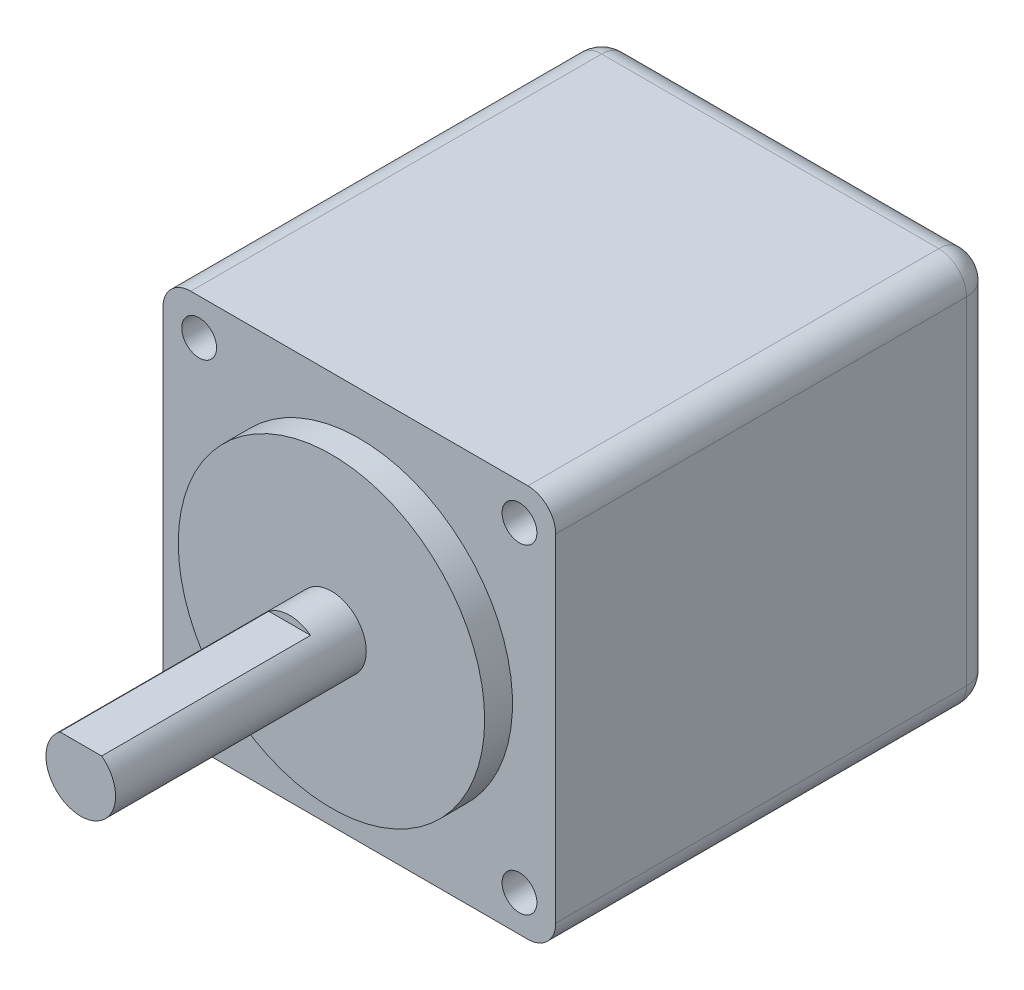
ISO-10303-21;
HEADER;
FILE_DESCRIPTION(('STEP AP214'),'2;1');
FILE_NAME('part.step','',(''),(''),'','','');
FILE_SCHEMA(('AUTOMOTIVE_DESIGN { 1 0 10303 214 1 1 1 1 }'));
ENDSEC;
DATA;
#1=APPLICATION_CONTEXT('core data for automotive mechanical design processes');
#2=APPLICATION_PROTOCOL_DEFINITION('international standard','automotive_design',2000,#1);
#3=PRODUCT_CONTEXT('',#1,'mechanical');
#4=PRODUCT('Part','Part','',(#3));
#5=PRODUCT_RELATED_PRODUCT_CATEGORY('part','',(#4));
#6=PRODUCT_DEFINITION_FORMATION('','',#4);
#7=PRODUCT_DEFINITION_CONTEXT('part definition',#1,'design');
#8=PRODUCT_DEFINITION('design','',#6,#7);
#9=PRODUCT_DEFINITION_SHAPE('','',#8);
#10=(LENGTH_UNIT() NAMED_UNIT(*) SI_UNIT(.MILLI.,.METRE.));
#11=(NAMED_UNIT(*) PLANE_ANGLE_UNIT() SI_UNIT($,.RADIAN.));
#12=(NAMED_UNIT(*) SI_UNIT($,.STERADIAN.) SOLID_ANGLE_UNIT());
#13=UNCERTAINTY_MEASURE_WITH_UNIT(LENGTH_MEASURE(1.E-05),#10,'distance_accuracy_value','');
#14=(GEOMETRIC_REPRESENTATION_CONTEXT(3) GLOBAL_UNCERTAINTY_ASSIGNED_CONTEXT((#13)) GLOBAL_UNIT_ASSIGNED_CONTEXT((#10,
#11,#12)) REPRESENTATION_CONTEXT('',''));
#15=CARTESIAN_POINT('',(0.,0.,0.));
#16=DIRECTION('',(0.,0.,1.));
#17=DIRECTION('',(1.,0.,0.));
#18=AXIS2_PLACEMENT_3D('',#15,#16,#17);
#19=CARTESIAN_POINT('',(0.,0.,33.5));
#20=DIRECTION('',(0.,0.,1.));
#21=DIRECTION('',(1.,0.,0.));
#22=AXIS2_PLACEMENT_3D('',#19,#20,#21);
#23=PLANE('',#22);
#24=CARTESIAN_POINT('',(0.,0.,33.5));
#25=DIRECTION('',(0.,0.,1.));
#26=DIRECTION('',(1.,0.,0.));
#27=AXIS2_PLACEMENT_3D('',#24,#25,#26);
#28=CIRCLE('',#27,11.);
#29=CARTESIAN_POINT('',(11.,0.,33.5));
#30=VERTEX_POINT('',#29);
#31=EDGE_CURVE('E144',#30,#30,#28,.T.);
#32=ORIENTED_EDGE('',*,*,#31,.T.);
#33=EDGE_LOOP('',(#32));
#34=FACE_BOUND('',#33,.T.);
#35=CARTESIAN_POINT('',(0.,0.,33.5));
#36=DIRECTION('',(0.,0.,1.));
#37=DIRECTION('',(1.,0.,0.));
#38=AXIS2_PLACEMENT_3D('',#35,#36,#37);
#39=CIRCLE('',#38,2.5);
#40=CARTESIAN_POINT('',(2.5,0.,33.5));
#41=VERTEX_POINT('',#40);
#42=EDGE_CURVE('E145',#41,#41,#39,.T.);
#43=ORIENTED_EDGE('',*,*,#42,.F.);
#44=EDGE_LOOP('',(#43));
#45=FACE_BOUND('',#44,.T.);
#46=ADVANCED_FACE('F33',(#34,#45),#23,.T.);
#47=CARTESIAN_POINT('',(14.1,14.1,31.5));
#48=DIRECTION('',(0.,0.,-1.));
#49=DIRECTION('',(-1.,0.,0.));
#50=AXIS2_PLACEMENT_3D('',#47,#48,#49);
#51=PLANE('',#50);
#52=CARTESIAN_POINT('',(-11.4999999999997,-11.5,31.5));
#53=DIRECTION('',(0.,0.,1.));
#54=DIRECTION('',(1.,0.,0.));
#55=AXIS2_PLACEMENT_3D('',#52,#53,#54);
#56=CIRCLE('',#55,1.25000000000024);
#57=CARTESIAN_POINT('',(-10.2499999999994,-11.5,31.5));
#58=VERTEX_POINT('',#57);
#59=EDGE_CURVE('E237',#58,#58,#56,.T.);
#60=ORIENTED_EDGE('',*,*,#59,.F.);
#61=EDGE_LOOP('',(#60));
#62=FACE_BOUND('',#61,.T.);
#63=CARTESIAN_POINT('',(11.5000000000003,-11.4999999999997,31.5));
#64=DIRECTION('',(0.,0.,1.));
#65=DIRECTION('',(1.,0.,0.));
#66=AXIS2_PLACEMENT_3D('',#63,#64,#65);
#67=CIRCLE('',#66,1.25000000000049);
#68=CARTESIAN_POINT('',(12.7500000000008,-11.4999999999997,31.5));
#69=VERTEX_POINT('',#68);
#70=EDGE_CURVE('E245',#69,#69,#67,.T.);
#71=ORIENTED_EDGE('',*,*,#70,.F.);
#72=EDGE_LOOP('',(#71));
#73=FACE_BOUND('',#72,.T.);
#74=CARTESIAN_POINT('',(11.5,11.5000000000003,31.5));
#75=DIRECTION('',(0.,0.,1.));
#76=DIRECTION('',(1.,0.,0.));
#77=AXIS2_PLACEMENT_3D('',#74,#75,#76);
#78=CIRCLE('',#77,1.25000000000035);
#79=CARTESIAN_POINT('',(12.7500000000003,11.5000000000003,31.5));
#80=VERTEX_POINT('',#79);
#81=EDGE_CURVE('E251',#80,#80,#78,.T.);
#82=ORIENTED_EDGE('',*,*,#81,.F.);
#83=EDGE_LOOP('',(#82));
#84=FACE_BOUND('',#83,.T.);
#85=CARTESIAN_POINT('',(-11.5,11.5,31.5));
#86=DIRECTION('',(0.,0.,1.));
#87=DIRECTION('',(1.,0.,0.));
#88=AXIS2_PLACEMENT_3D('',#85,#86,#87);
#89=CIRCLE('',#88,1.25);
#90=CARTESIAN_POINT('',(-10.25,11.5,31.5));
#91=VERTEX_POINT('',#90);
#92=EDGE_CURVE('E257',#91,#91,#89,.T.);
#93=ORIENTED_EDGE('',*,*,#92,.F.);
#94=EDGE_LOOP('',(#93));
#95=FACE_BOUND('',#94,.T.);
#96=DIRECTION('',(0.,-1.,0.));
#97=VECTOR('',#96,1.);
#98=CARTESIAN_POINT('',(-14.1,-14.1,31.5));
#99=LINE('',#98,#97);
#100=CARTESIAN_POINT('',(-14.1,12.1,31.5));
#101=VERTEX_POINT('',#100);
#102=CARTESIAN_POINT('',(-14.1,-12.1,31.5));
#103=VERTEX_POINT('',#102);
#104=EDGE_CURVE('E159',#101,#103,#99,.T.);
#105=ORIENTED_EDGE('',*,*,#104,.T.);
#106=CARTESIAN_POINT('',(-12.1,-12.1,31.5));
#107=DIRECTION('',(0.,0.,-1.));
#108=DIRECTION('',(-1.,0.,0.));
#109=AXIS2_PLACEMENT_3D('',#106,#107,#108);
#110=CIRCLE('',#109,2.);
#111=CARTESIAN_POINT('',(-12.1,-14.1,31.5));
#112=VERTEX_POINT('',#111);
#113=EDGE_CURVE('E11',#103,#112,#110,.F.);
#114=ORIENTED_EDGE('',*,*,#113,.T.);
#115=DIRECTION('',(1.,0.,0.));
#116=VECTOR('',#115,1.);
#117=CARTESIAN_POINT('',(-14.1,-14.1,31.5));
#118=LINE('',#117,#116);
#119=CARTESIAN_POINT('',(12.1,-14.1,31.5));
#120=VERTEX_POINT('',#119);
#121=EDGE_CURVE('E162',#112,#120,#118,.T.);
#122=ORIENTED_EDGE('',*,*,#121,.T.);
#123=CARTESIAN_POINT('',(12.1,-12.1,31.5));
#124=DIRECTION('',(0.,0.,-1.));
#125=DIRECTION('',(-1.,0.,0.));
#126=AXIS2_PLACEMENT_3D('',#123,#124,#125);
#127=CIRCLE('',#126,2.);
#128=CARTESIAN_POINT('',(14.1,-12.1,31.5));
#129=VERTEX_POINT('',#128);
#130=EDGE_CURVE('E42',#120,#129,#127,.F.);
#131=ORIENTED_EDGE('',*,*,#130,.T.);
#132=DIRECTION('',(0.,1.,0.));
#133=VECTOR('',#132,1.);
#134=CARTESIAN_POINT('',(14.1,-14.1,31.5));
#135=LINE('',#134,#133);
#136=CARTESIAN_POINT('',(14.1,12.1,31.5));
#137=VERTEX_POINT('',#136);
#138=EDGE_CURVE('E148',#129,#137,#135,.T.);
#139=ORIENTED_EDGE('',*,*,#138,.T.);
#140=CARTESIAN_POINT('',(12.1,12.1,31.5));
#141=DIRECTION('',(0.,0.,-1.));
#142=DIRECTION('',(-1.,0.,0.));
#143=AXIS2_PLACEMENT_3D('',#140,#141,#142);
#144=CIRCLE('',#143,2.);
#145=CARTESIAN_POINT('',(12.1,14.1,31.5));
#146=VERTEX_POINT('',#145);
#147=EDGE_CURVE('E200',#137,#146,#144,.F.);
#148=ORIENTED_EDGE('',*,*,#147,.T.);
#149=DIRECTION('',(-1.,0.,0.));
#150=VECTOR('',#149,1.);
#151=CARTESIAN_POINT('',(-14.1,14.1,31.5));
#152=LINE('',#151,#150);
#153=CARTESIAN_POINT('',(-12.1,14.1,31.5));
#154=VERTEX_POINT('',#153);
#155=EDGE_CURVE('E156',#146,#154,#152,.T.);
#156=ORIENTED_EDGE('',*,*,#155,.T.);
#157=CARTESIAN_POINT('',(-12.1,12.1,31.5));
#158=DIRECTION('',(0.,0.,-1.));
#159=DIRECTION('',(-1.,0.,0.));
#160=AXIS2_PLACEMENT_3D('',#157,#158,#159);
#161=CIRCLE('',#160,2.);
#162=EDGE_CURVE('E202',#154,#101,#161,.F.);
#163=ORIENTED_EDGE('',*,*,#162,.T.);
#164=EDGE_LOOP('',(#105,#114,#122,#131,#139,#148,#156,#163));
#165=FACE_BOUND('',#164,.T.);
#166=CARTESIAN_POINT('',(0.,0.,31.5));
#167=DIRECTION('',(0.,0.,-1.));
#168=DIRECTION('',(-1.,0.,0.));
#169=AXIS2_PLACEMENT_3D('',#166,#167,#168);
#170=CIRCLE('',#169,11.);
#171=CARTESIAN_POINT('',(-11.,0.,31.5));
#172=VERTEX_POINT('',#171);
#173=EDGE_CURVE('E134',#172,#172,#170,.F.);
#174=ORIENTED_EDGE('',*,*,#173,.F.);
#175=EDGE_LOOP('',(#174));
#176=FACE_BOUND('',#175,.T.);
#177=ADVANCED_FACE('F278',(#62,#73,#84,#95,#165,#176),#51,.F.);
#178=CARTESIAN_POINT('',(14.1,-14.1,31.5));
#179=DIRECTION('',(-1.,0.,0.));
#180=DIRECTION('',(0.,0.,1.));
#181=AXIS2_PLACEMENT_3D('',#178,#179,#180);
#182=PLANE('',#181);
#183=ORIENTED_EDGE('',*,*,#138,.F.);
#184=DIRECTION('',(0.,0.,-1.));
#185=VECTOR('',#184,1.);
#186=CARTESIAN_POINT('',(14.1,-12.1,31.5));
#187=LINE('',#186,#185);
#188=CARTESIAN_POINT('',(14.1,-12.1,2.));
#189=VERTEX_POINT('',#188);
#190=EDGE_CURVE('E50',#129,#189,#187,.T.);
#191=ORIENTED_EDGE('',*,*,#190,.T.);
#192=DIRECTION('',(0.,1.,0.));
#193=VECTOR('',#192,1.);
#194=CARTESIAN_POINT('',(14.1,14.1,2.));
#195=LINE('',#194,#193);
#196=CARTESIAN_POINT('',(14.1,12.1,2.));
#197=VERTEX_POINT('',#196);
#198=EDGE_CURVE('E55',#189,#197,#195,.T.);
#199=ORIENTED_EDGE('',*,*,#198,.T.);
#200=DIRECTION('',(0.,0.,-1.));
#201=VECTOR('',#200,1.);
#202=CARTESIAN_POINT('',(14.1,12.1,31.5));
#203=LINE('',#202,#201);
#204=EDGE_CURVE('E196',#197,#137,#203,.F.);
#205=ORIENTED_EDGE('',*,*,#204,.T.);
#206=EDGE_LOOP('',(#183,#191,#199,#205));
#207=FACE_BOUND('',#206,.T.);
#208=ADVANCED_FACE('F284',(#207),#182,.F.);
#209=CARTESIAN_POINT('',(-14.1,14.1,31.5));
#210=DIRECTION('',(0.,-1.,0.));
#211=DIRECTION('',(0.,0.,-1.));
#212=AXIS2_PLACEMENT_3D('',#209,#210,#211);
#213=PLANE('',#212);
#214=DIRECTION('',(-1.,0.,0.));
#215=VECTOR('',#214,1.);
#216=CARTESIAN_POINT('',(-14.1,14.1,2.));
#217=LINE('',#216,#215);
#218=CARTESIAN_POINT('',(12.1,14.1,2.));
#219=VERTEX_POINT('',#218);
#220=CARTESIAN_POINT('',(-12.1,14.1,2.));
#221=VERTEX_POINT('',#220);
#222=EDGE_CURVE('E170',#219,#221,#217,.T.);
#223=ORIENTED_EDGE('',*,*,#222,.T.);
#224=DIRECTION('',(0.,0.,-1.));
#225=VECTOR('',#224,1.);
#226=CARTESIAN_POINT('',(-12.1,14.1,31.5));
#227=LINE('',#226,#225);
#228=EDGE_CURVE('E173',#221,#154,#227,.F.);
#229=ORIENTED_EDGE('',*,*,#228,.T.);
#230=ORIENTED_EDGE('',*,*,#155,.F.);
#231=DIRECTION('',(0.,0.,-1.));
#232=VECTOR('',#231,1.);
#233=CARTESIAN_POINT('',(12.1,14.1,31.5));
#234=LINE('',#233,#232);
#235=EDGE_CURVE('E168',#146,#219,#234,.T.);
#236=ORIENTED_EDGE('',*,*,#235,.T.);
#237=EDGE_LOOP('',(#223,#229,#230,#236));
#238=FACE_BOUND('',#237,.T.);
#239=ADVANCED_FACE('F305',(#238),#213,.F.);
#240=CARTESIAN_POINT('',(-14.1,-14.1,31.5));
#241=DIRECTION('',(1.,0.,0.));
#242=DIRECTION('',(0.,0.,-1.));
#243=AXIS2_PLACEMENT_3D('',#240,#241,#242);
#244=PLANE('',#243);
#245=DIRECTION('',(0.,-1.,0.));
#246=VECTOR('',#245,1.);
#247=CARTESIAN_POINT('',(-14.1,-14.1,2.));
#248=LINE('',#247,#246);
#249=CARTESIAN_POINT('',(-14.1,12.1,2.));
#250=VERTEX_POINT('',#249);
#251=CARTESIAN_POINT('',(-14.1,-12.1,2.));
#252=VERTEX_POINT('',#251);
#253=EDGE_CURVE('E186',#250,#252,#248,.T.);
#254=ORIENTED_EDGE('',*,*,#253,.T.);
#255=DIRECTION('',(0.,0.,-1.));
#256=VECTOR('',#255,1.);
#257=CARTESIAN_POINT('',(-14.1,-12.1,31.5));
#258=LINE('',#257,#256);
#259=EDGE_CURVE('E188',#252,#103,#258,.F.);
#260=ORIENTED_EDGE('',*,*,#259,.T.);
#261=ORIENTED_EDGE('',*,*,#104,.F.);
#262=DIRECTION('',(0.,0.,-1.));
#263=VECTOR('',#262,1.);
#264=CARTESIAN_POINT('',(-14.1,12.1,31.5));
#265=LINE('',#264,#263);
#266=EDGE_CURVE('E184',#101,#250,#265,.T.);
#267=ORIENTED_EDGE('',*,*,#266,.T.);
#268=EDGE_LOOP('',(#254,#260,#261,#267));
#269=FACE_BOUND('',#268,.T.);
#270=ADVANCED_FACE('F301',(#269),#244,.F.);
#271=CARTESIAN_POINT('',(-14.1,-14.1,31.5));
#272=DIRECTION('',(0.,1.,0.));
#273=DIRECTION('',(0.,0.,1.));
#274=AXIS2_PLACEMENT_3D('',#271,#272,#273);
#275=PLANE('',#274);
#276=ORIENTED_EDGE('',*,*,#121,.F.);
#277=DIRECTION('',(0.,0.,-1.));
#278=VECTOR('',#277,1.);
#279=CARTESIAN_POINT('',(-12.1,-14.1,31.5));
#280=LINE('',#279,#278);
#281=CARTESIAN_POINT('',(-12.1,-14.1,2.));
#282=VERTEX_POINT('',#281);
#283=EDGE_CURVE('E194',#112,#282,#280,.T.);
#284=ORIENTED_EDGE('',*,*,#283,.T.);
#285=DIRECTION('',(1.,0.,0.));
#286=VECTOR('',#285,1.);
#287=CARTESIAN_POINT('',(14.1,-14.1,2.));
#288=LINE('',#287,#286);
#289=CARTESIAN_POINT('',(12.1,-14.1,2.));
#290=VERTEX_POINT('',#289);
#291=EDGE_CURVE('E192',#282,#290,#288,.T.);
#292=ORIENTED_EDGE('',*,*,#291,.T.);
#293=DIRECTION('',(0.,0.,-1.));
#294=VECTOR('',#293,1.);
#295=CARTESIAN_POINT('',(12.1,-14.1,31.5));
#296=LINE('',#295,#294);
#297=EDGE_CURVE('E190',#290,#120,#296,.F.);
#298=ORIENTED_EDGE('',*,*,#297,.T.);
#299=EDGE_LOOP('',(#276,#284,#292,#298));
#300=FACE_BOUND('',#299,.T.);
#301=ADVANCED_FACE('F297',(#300),#275,.F.);
#302=CARTESIAN_POINT('',(14.1,14.1,0.));
#303=DIRECTION('',(0.,0.,-1.));
#304=DIRECTION('',(-1.,0.,0.));
#305=AXIS2_PLACEMENT_3D('',#302,#303,#304);
#306=PLANE('',#305);
#307=DIRECTION('',(0.,-1.,0.));
#308=VECTOR('',#307,1.);
#309=CARTESIAN_POINT('',(-12.1,14.1,0.));
#310=LINE('',#309,#308);
#311=CARTESIAN_POINT('',(-12.1,-12.1,0.));
#312=VERTEX_POINT('',#311);
#313=CARTESIAN_POINT('',(-12.1,12.1,0.));
#314=VERTEX_POINT('',#313);
#315=EDGE_CURVE('E179',#312,#314,#310,.F.);
#316=ORIENTED_EDGE('',*,*,#315,.T.);
#317=DIRECTION('',(-1.,0.,0.));
#318=VECTOR('',#317,1.);
#319=CARTESIAN_POINT('',(14.1,12.1,0.));
#320=LINE('',#319,#318);
#321=CARTESIAN_POINT('',(12.1,12.1,0.));
#322=VERTEX_POINT('',#321);
#323=EDGE_CURVE('E181',#314,#322,#320,.F.);
#324=ORIENTED_EDGE('',*,*,#323,.T.);
#325=DIRECTION('',(0.,1.,0.));
#326=VECTOR('',#325,1.);
#327=CARTESIAN_POINT('',(12.1,-14.1,0.));
#328=LINE('',#327,#326);
#329=CARTESIAN_POINT('',(12.1,-12.1,0.));
#330=VERTEX_POINT('',#329);
#331=EDGE_CURVE('E175',#322,#330,#328,.F.);
#332=ORIENTED_EDGE('',*,*,#331,.T.);
#333=DIRECTION('',(1.,0.,0.));
#334=VECTOR('',#333,1.);
#335=CARTESIAN_POINT('',(-14.1,-12.1,0.));
#336=LINE('',#335,#334);
#337=EDGE_CURVE('E177',#330,#312,#336,.F.);
#338=ORIENTED_EDGE('',*,*,#337,.T.);
#339=EDGE_LOOP('',(#316,#324,#332,#338));
#340=FACE_BOUND('',#339,.T.);
#341=ADVANCED_FACE('F292',(#340),#306,.T.);
#342=CARTESIAN_POINT('',(0.,0.,33.5));
#343=DIRECTION('',(0.,0.,-1.));
#344=DIRECTION('',(-1.,0.,0.));
#345=AXIS2_PLACEMENT_3D('',#342,#343,#344);
#346=CYLINDRICAL_SURFACE('',#345,11.);
#347=ORIENTED_EDGE('',*,*,#31,.F.);
#348=EDGE_LOOP('',(#347));
#349=FACE_BOUND('',#348,.T.);
#350=ORIENTED_EDGE('',*,*,#173,.T.);
#351=EDGE_LOOP('',(#350));
#352=FACE_BOUND('',#351,.T.);
#353=ADVANCED_FACE('F290',(#349,#352),#346,.T.);
#354=CARTESIAN_POINT('',(0.,0.,51.5));
#355=DIRECTION('',(0.,0.,-1.));
#356=DIRECTION('',(-1.,0.,0.));
#357=AXIS2_PLACEMENT_3D('',#354,#355,#356);
#358=CYLINDRICAL_SURFACE('',#357,2.5);
#359=CARTESIAN_POINT('',(0.,0.,51.5));
#360=DIRECTION('',(0.,0.,1.));
#361=DIRECTION('',(1.,0.,0.));
#362=AXIS2_PLACEMENT_3D('',#359,#360,#361);
#363=CIRCLE('',#362,2.5);
#364=CARTESIAN_POINT('',(-1.5,2.,51.5));
#365=VERTEX_POINT('',#364);
#366=CARTESIAN_POINT('',(1.5,2.,51.5));
#367=VERTEX_POINT('',#366);
#368=EDGE_CURVE('E140',#365,#367,#363,.T.);
#369=ORIENTED_EDGE('',*,*,#368,.F.);
#370=DIRECTION('',(0.,0.,-1.));
#371=VECTOR('',#370,1.);
#372=CARTESIAN_POINT('',(-1.5,2.,51.5));
#373=LINE('',#372,#371);
#374=CARTESIAN_POINT('',(-1.5,2.,36.5));
#375=VERTEX_POINT('',#374);
#376=EDGE_CURVE('E129',#365,#375,#373,.T.);
#377=ORIENTED_EDGE('',*,*,#376,.T.);
#378=CARTESIAN_POINT('',(0.,0.,36.5));
#379=DIRECTION('',(0.,0.,-1.));
#380=DIRECTION('',(-1.,0.,0.));
#381=AXIS2_PLACEMENT_3D('',#378,#379,#380);
#382=CIRCLE('',#381,2.5);
#383=CARTESIAN_POINT('',(1.5,2.,36.5));
#384=VERTEX_POINT('',#383);
#385=EDGE_CURVE('E133',#375,#384,#382,.T.);
#386=ORIENTED_EDGE('',*,*,#385,.T.);
#387=DIRECTION('',(0.,0.,-1.));
#388=VECTOR('',#387,1.);
#389=CARTESIAN_POINT('',(1.5,2.,51.5));
#390=LINE('',#389,#388);
#391=EDGE_CURVE('E126',#384,#367,#390,.F.);
#392=ORIENTED_EDGE('',*,*,#391,.T.);
#393=EDGE_LOOP('',(#369,#377,#386,#392));
#394=FACE_BOUND('',#393,.T.);
#395=ORIENTED_EDGE('',*,*,#42,.T.);
#396=EDGE_LOOP('',(#395));
#397=FACE_BOUND('',#396,.T.);
#398=ADVANCED_FACE('F138',(#394,#397),#358,.T.);
#399=CARTESIAN_POINT('',(0.,0.,51.5));
#400=DIRECTION('',(0.,0.,1.));
#401=DIRECTION('',(1.,0.,0.));
#402=AXIS2_PLACEMENT_3D('',#399,#400,#401);
#403=PLANE('',#402);
#404=DIRECTION('',(1.,0.,0.));
#405=VECTOR('',#404,1.);
#406=CARTESIAN_POINT('',(0.,2.,51.5));
#407=LINE('',#406,#405);
#408=EDGE_CURVE('E122',#365,#367,#407,.T.);
#409=ORIENTED_EDGE('',*,*,#408,.F.);
#410=ORIENTED_EDGE('',*,*,#368,.T.);
#411=EDGE_LOOP('',(#409,#410));
#412=FACE_BOUND('',#411,.T.);
#413=ADVANCED_FACE('F143',(#412),#403,.T.);
#414=CARTESIAN_POINT('',(-5.,2.5,36.5));
#415=DIRECTION('',(0.,0.,-1.));
#416=DIRECTION('',(-1.,0.,0.));
#417=AXIS2_PLACEMENT_3D('',#414,#415,#416);
#418=PLANE('',#417);
#419=DIRECTION('',(1.,0.,0.));
#420=VECTOR('',#419,1.);
#421=CARTESIAN_POINT('',(-5.,2.,36.5));
#422=LINE('',#421,#420);
#423=EDGE_CURVE('E141',#375,#384,#422,.T.);
#424=ORIENTED_EDGE('',*,*,#423,.T.);
#425=ORIENTED_EDGE('',*,*,#385,.F.);
#426=EDGE_LOOP('',(#424,#425));
#427=FACE_BOUND('',#426,.T.);
#428=ADVANCED_FACE('F266',(#427),#418,.F.);
#429=CARTESIAN_POINT('',(-5.,2.,51.5));
#430=DIRECTION('',(0.,-1.,0.));
#431=DIRECTION('',(0.,0.,-1.));
#432=AXIS2_PLACEMENT_3D('',#429,#430,#431);
#433=PLANE('',#432);
#434=ORIENTED_EDGE('',*,*,#408,.T.);
#435=ORIENTED_EDGE('',*,*,#391,.F.);
#436=ORIENTED_EDGE('',*,*,#423,.F.);
#437=ORIENTED_EDGE('',*,*,#376,.F.);
#438=EDGE_LOOP('',(#434,#435,#436,#437));
#439=FACE_BOUND('',#438,.T.);
#440=ADVANCED_FACE('F124',(#439),#433,.F.);
#441=CARTESIAN_POINT('',(-11.5,11.5,29.));
#442=DIRECTION('',(0.,0.,1.));
#443=DIRECTION('',(1.,0.,0.));
#444=AXIS2_PLACEMENT_3D('',#441,#442,#443);
#445=CYLINDRICAL_SURFACE('',#444,1.25);
#446=CARTESIAN_POINT('',(-11.5,11.5,29.));
#447=DIRECTION('',(0.,0.,1.));
#448=DIRECTION('',(1.,0.,0.));
#449=AXIS2_PLACEMENT_3D('',#446,#447,#448);
#450=CIRCLE('',#449,1.25);
#451=CARTESIAN_POINT('',(-10.25,11.5,29.));
#452=VERTEX_POINT('',#451);
#453=EDGE_CURVE('E260',#452,#452,#450,.T.);
#454=ORIENTED_EDGE('',*,*,#453,.F.);
#455=EDGE_LOOP('',(#454));
#456=FACE_BOUND('',#455,.T.);
#457=ORIENTED_EDGE('',*,*,#92,.T.);
#458=EDGE_LOOP('',(#457));
#459=FACE_BOUND('',#458,.T.);
#460=ADVANCED_FACE('F273',(#456,#459),#445,.F.);
#461=CARTESIAN_POINT('',(-11.5,11.5,29.));
#462=DIRECTION('',(0.,0.,1.));
#463=DIRECTION('',(1.,0.,0.));
#464=AXIS2_PLACEMENT_3D('',#461,#462,#463);
#465=PLANE('',#464);
#466=ORIENTED_EDGE('',*,*,#453,.T.);
#467=EDGE_LOOP('',(#466));
#468=FACE_BOUND('',#467,.T.);
#469=ADVANCED_FACE('F418',(#468),#465,.T.);
#470=CARTESIAN_POINT('',(11.5,11.5000000000003,29.));
#471=DIRECTION('',(0.,0.,1.));
#472=DIRECTION('',(1.,0.,0.));
#473=AXIS2_PLACEMENT_3D('',#470,#471,#472);
#474=CYLINDRICAL_SURFACE('',#473,1.25000000000035);
#475=CARTESIAN_POINT('',(11.5,11.5000000000003,29.));
#476=DIRECTION('',(0.,0.,1.));
#477=DIRECTION('',(1.,0.,0.));
#478=AXIS2_PLACEMENT_3D('',#475,#476,#477);
#479=CIRCLE('',#478,1.25000000000035);
#480=CARTESIAN_POINT('',(12.7500000000003,11.5000000000003,29.));
#481=VERTEX_POINT('',#480);
#482=EDGE_CURVE('E254',#481,#481,#479,.T.);
#483=ORIENTED_EDGE('',*,*,#482,.F.);
#484=EDGE_LOOP('',(#483));
#485=FACE_BOUND('',#484,.T.);
#486=ORIENTED_EDGE('',*,*,#81,.T.);
#487=EDGE_LOOP('',(#486));
#488=FACE_BOUND('',#487,.T.);
#489=ADVANCED_FACE('F414',(#485,#488),#474,.F.);
#490=CARTESIAN_POINT('',(11.5,11.5000000000003,29.));
#491=DIRECTION('',(0.,0.,1.));
#492=DIRECTION('',(1.,0.,0.));
#493=AXIS2_PLACEMENT_3D('',#490,#491,#492);
#494=PLANE('',#493);
#495=ORIENTED_EDGE('',*,*,#482,.T.);
#496=EDGE_LOOP('',(#495));
#497=FACE_BOUND('',#496,.T.);
#498=ADVANCED_FACE('F410',(#497),#494,.T.);
#499=CARTESIAN_POINT('',(11.5000000000003,-11.4999999999997,29.));
#500=DIRECTION('',(0.,0.,1.));
#501=DIRECTION('',(1.,0.,0.));
#502=AXIS2_PLACEMENT_3D('',#499,#500,#501);
#503=CYLINDRICAL_SURFACE('',#502,1.25000000000049);
#504=CARTESIAN_POINT('',(11.5000000000003,-11.4999999999997,29.));
#505=DIRECTION('',(0.,0.,1.));
#506=DIRECTION('',(1.,0.,0.));
#507=AXIS2_PLACEMENT_3D('',#504,#505,#506);
#508=CIRCLE('',#507,1.25000000000049);
#509=CARTESIAN_POINT('',(12.7500000000008,-11.4999999999997,29.));
#510=VERTEX_POINT('',#509);
#511=EDGE_CURVE('E248',#510,#510,#508,.T.);
#512=ORIENTED_EDGE('',*,*,#511,.F.);
#513=EDGE_LOOP('',(#512));
#514=FACE_BOUND('',#513,.T.);
#515=ORIENTED_EDGE('',*,*,#70,.T.);
#516=EDGE_LOOP('',(#515));
#517=FACE_BOUND('',#516,.T.);
#518=ADVANCED_FACE('F406',(#514,#517),#503,.F.);
#519=CARTESIAN_POINT('',(11.5000000000003,-11.4999999999997,29.));
#520=DIRECTION('',(0.,0.,1.));
#521=DIRECTION('',(1.,0.,0.));
#522=AXIS2_PLACEMENT_3D('',#519,#520,#521);
#523=PLANE('',#522);
#524=ORIENTED_EDGE('',*,*,#511,.T.);
#525=EDGE_LOOP('',(#524));
#526=FACE_BOUND('',#525,.T.);
#527=ADVANCED_FACE('F400',(#526),#523,.T.);
#528=CARTESIAN_POINT('',(-11.4999999999997,-11.5,29.));
#529=DIRECTION('',(0.,0.,1.));
#530=DIRECTION('',(1.,0.,0.));
#531=AXIS2_PLACEMENT_3D('',#528,#529,#530);
#532=CYLINDRICAL_SURFACE('',#531,1.25000000000024);
#533=CARTESIAN_POINT('',(-11.4999999999997,-11.5,29.));
#534=DIRECTION('',(0.,0.,1.));
#535=DIRECTION('',(1.,0.,0.));
#536=AXIS2_PLACEMENT_3D('',#533,#534,#535);
#537=CIRCLE('',#536,1.25000000000024);
#538=CARTESIAN_POINT('',(-10.2499999999994,-11.5,29.));
#539=VERTEX_POINT('',#538);
#540=EDGE_CURVE('E240',#539,#539,#537,.T.);
#541=ORIENTED_EDGE('',*,*,#540,.F.);
#542=EDGE_LOOP('',(#541));
#543=FACE_BOUND('',#542,.T.);
#544=ORIENTED_EDGE('',*,*,#59,.T.);
#545=EDGE_LOOP('',(#544));
#546=FACE_BOUND('',#545,.T.);
#547=ADVANCED_FACE('F394',(#543,#546),#532,.F.);
#548=CARTESIAN_POINT('',(-11.4999999999997,-11.5,29.));
#549=DIRECTION('',(0.,0.,1.));
#550=DIRECTION('',(1.,0.,0.));
#551=AXIS2_PLACEMENT_3D('',#548,#549,#550);
#552=PLANE('',#551);
#553=ORIENTED_EDGE('',*,*,#540,.T.);
#554=EDGE_LOOP('',(#553));
#555=FACE_BOUND('',#554,.T.);
#556=ADVANCED_FACE('F356',(#555),#552,.T.);
#557=CARTESIAN_POINT('',(12.1,-12.1,31.5));
#558=DIRECTION('',(0.,0.,-1.));
#559=DIRECTION('',(-1.,0.,0.));
#560=AXIS2_PLACEMENT_3D('',#557,#558,#559);
#561=CYLINDRICAL_SURFACE('',#560,2.);
#562=ORIENTED_EDGE('',*,*,#130,.F.);
#563=ORIENTED_EDGE('',*,*,#297,.F.);
#564=CARTESIAN_POINT('',(12.1,-12.1,2.));
#565=DIRECTION('',(0.,0.,-1.));
#566=DIRECTION('',(-1.,0.,0.));
#567=AXIS2_PLACEMENT_3D('',#564,#565,#566);
#568=CIRCLE('',#567,2.);
#569=EDGE_CURVE('E232',#189,#290,#568,.T.);
#570=ORIENTED_EDGE('',*,*,#569,.F.);
#571=ORIENTED_EDGE('',*,*,#190,.F.);
#572=EDGE_LOOP('',(#562,#563,#570,#571));
#573=FACE_BOUND('',#572,.T.);
#574=ADVANCED_FACE('F35',(#573),#561,.T.);
#575=CARTESIAN_POINT('',(-12.1,-12.1,31.5));
#576=DIRECTION('',(0.,0.,-1.));
#577=DIRECTION('',(-1.,0.,0.));
#578=AXIS2_PLACEMENT_3D('',#575,#576,#577);
#579=CYLINDRICAL_SURFACE('',#578,2.);
#580=ORIENTED_EDGE('',*,*,#113,.F.);
#581=ORIENTED_EDGE('',*,*,#259,.F.);
#582=CARTESIAN_POINT('',(-12.1,-12.1,2.));
#583=DIRECTION('',(0.,0.,-1.));
#584=DIRECTION('',(-1.,0.,0.));
#585=AXIS2_PLACEMENT_3D('',#582,#583,#584);
#586=CIRCLE('',#585,2.);
#587=EDGE_CURVE('E230',#282,#252,#586,.T.);
#588=ORIENTED_EDGE('',*,*,#587,.F.);
#589=ORIENTED_EDGE('',*,*,#283,.F.);
#590=EDGE_LOOP('',(#580,#581,#588,#589));
#591=FACE_BOUND('',#590,.T.);
#592=ADVANCED_FACE('F349',(#591),#579,.T.);
#593=CARTESIAN_POINT('',(-14.1,-12.1,2.));
#594=DIRECTION('',(-1.,0.,0.));
#595=DIRECTION('',(0.,0.,1.));
#596=AXIS2_PLACEMENT_3D('',#593,#594,#595);
#597=CYLINDRICAL_SURFACE('',#596,2.);
#598=CARTESIAN_POINT('',(12.1,-12.1,2.));
#599=DIRECTION('',(1.,0.,0.));
#600=DIRECTION('',(0.,0.,-1.));
#601=AXIS2_PLACEMENT_3D('',#598,#599,#600);
#602=CIRCLE('',#601,2.);
#603=EDGE_CURVE('E37',#290,#330,#602,.T.);
#604=ORIENTED_EDGE('',*,*,#603,.F.);
#605=ORIENTED_EDGE('',*,*,#291,.F.);
#606=CARTESIAN_POINT('',(-12.1,-12.1,2.));
#607=DIRECTION('',(-1.,0.,0.));
#608=DIRECTION('',(0.,0.,1.));
#609=AXIS2_PLACEMENT_3D('',#606,#607,#608);
#610=CIRCLE('',#609,2.);
#611=EDGE_CURVE('E227',#312,#282,#610,.T.);
#612=ORIENTED_EDGE('',*,*,#611,.F.);
#613=ORIENTED_EDGE('',*,*,#337,.F.);
#614=EDGE_LOOP('',(#604,#605,#612,#613));
#615=FACE_BOUND('',#614,.T.);
#616=ADVANCED_FACE('F347',(#615),#597,.T.);
#617=CARTESIAN_POINT('',(12.1,-12.1,2.));
#618=DIRECTION('',(0.,0.,1.));
#619=DIRECTION('',(1.,0.,0.));
#620=AXIS2_PLACEMENT_3D('',#617,#618,#619);
#621=SPHERICAL_SURFACE('',#620,2.);
#622=ORIENTED_EDGE('',*,*,#569,.T.);
#623=ORIENTED_EDGE('',*,*,#603,.T.);
#624=CARTESIAN_POINT('',(12.1,-12.1,2.));
#625=DIRECTION('',(0.,-1.,0.));
#626=DIRECTION('',(0.,0.,-1.));
#627=AXIS2_PLACEMENT_3D('',#624,#625,#626);
#628=CIRCLE('',#627,2.);
#629=EDGE_CURVE('E224',#189,#330,#628,.F.);
#630=ORIENTED_EDGE('',*,*,#629,.F.);
#631=EDGE_LOOP('',(#622,#623,#630));
#632=FACE_BOUND('',#631,.T.);
#633=ADVANCED_FACE('F343',(#632),#621,.T.);
#634=CARTESIAN_POINT('',(-12.1,-12.1,2.));
#635=DIRECTION('',(0.,0.,1.));
#636=DIRECTION('',(1.,0.,0.));
#637=AXIS2_PLACEMENT_3D('',#634,#635,#636);
#638=SPHERICAL_SURFACE('',#637,2.);
#639=ORIENTED_EDGE('',*,*,#611,.T.);
#640=ORIENTED_EDGE('',*,*,#587,.T.);
#641=CARTESIAN_POINT('',(-12.1,-12.1,2.));
#642=DIRECTION('',(0.,-1.,0.));
#643=DIRECTION('',(0.,0.,-1.));
#644=AXIS2_PLACEMENT_3D('',#641,#642,#643);
#645=CIRCLE('',#644,2.);
#646=EDGE_CURVE('E221',#312,#252,#645,.F.);
#647=ORIENTED_EDGE('',*,*,#646,.F.);
#648=EDGE_LOOP('',(#639,#640,#647));
#649=FACE_BOUND('',#648,.T.);
#650=ADVANCED_FACE('F339',(#649),#638,.T.);
#651=CARTESIAN_POINT('',(12.1,-14.1,2.));
#652=DIRECTION('',(0.,-1.,0.));
#653=DIRECTION('',(0.,0.,-1.));
#654=AXIS2_PLACEMENT_3D('',#651,#652,#653);
#655=CYLINDRICAL_SURFACE('',#654,2.);
#656=ORIENTED_EDGE('',*,*,#629,.T.);
#657=ORIENTED_EDGE('',*,*,#331,.F.);
#658=CARTESIAN_POINT('',(12.1,12.1,2.));
#659=DIRECTION('',(0.,1.,0.));
#660=DIRECTION('',(0.,0.,1.));
#661=AXIS2_PLACEMENT_3D('',#658,#659,#660);
#662=CIRCLE('',#661,2.);
#663=EDGE_CURVE('E218',#197,#322,#662,.T.);
#664=ORIENTED_EDGE('',*,*,#663,.F.);
#665=ORIENTED_EDGE('',*,*,#198,.F.);
#666=EDGE_LOOP('',(#656,#657,#664,#665));
#667=FACE_BOUND('',#666,.T.);
#668=ADVANCED_FACE('F335',(#667),#655,.T.);
#669=CARTESIAN_POINT('',(12.1,12.1,31.5));
#670=DIRECTION('',(0.,0.,-1.));
#671=DIRECTION('',(-1.,0.,0.));
#672=AXIS2_PLACEMENT_3D('',#669,#670,#671);
#673=CYLINDRICAL_SURFACE('',#672,2.);
#674=ORIENTED_EDGE('',*,*,#147,.F.);
#675=ORIENTED_EDGE('',*,*,#204,.F.);
#676=CARTESIAN_POINT('',(12.1,12.1,2.));
#677=DIRECTION('',(0.,0.,-1.));
#678=DIRECTION('',(-1.,0.,0.));
#679=AXIS2_PLACEMENT_3D('',#676,#677,#678);
#680=CIRCLE('',#679,2.);
#681=EDGE_CURVE('E215',#219,#197,#680,.T.);
#682=ORIENTED_EDGE('',*,*,#681,.F.);
#683=ORIENTED_EDGE('',*,*,#235,.F.);
#684=EDGE_LOOP('',(#674,#675,#682,#683));
#685=FACE_BOUND('',#684,.T.);
#686=ADVANCED_FACE('F331',(#685),#673,.T.);
#687=CARTESIAN_POINT('',(-12.1,12.1,31.5));
#688=DIRECTION('',(0.,0.,-1.));
#689=DIRECTION('',(-1.,0.,0.));
#690=AXIS2_PLACEMENT_3D('',#687,#688,#689);
#691=CYLINDRICAL_SURFACE('',#690,2.);
#692=ORIENTED_EDGE('',*,*,#162,.F.);
#693=ORIENTED_EDGE('',*,*,#228,.F.);
#694=CARTESIAN_POINT('',(-12.1,12.1,2.));
#695=DIRECTION('',(0.,0.,-1.));
#696=DIRECTION('',(-1.,0.,0.));
#697=AXIS2_PLACEMENT_3D('',#694,#695,#696);
#698=CIRCLE('',#697,2.);
#699=EDGE_CURVE('E212',#250,#221,#698,.T.);
#700=ORIENTED_EDGE('',*,*,#699,.F.);
#701=ORIENTED_EDGE('',*,*,#266,.F.);
#702=EDGE_LOOP('',(#692,#693,#700,#701));
#703=FACE_BOUND('',#702,.T.);
#704=ADVANCED_FACE('F327',(#703),#691,.T.);
#705=CARTESIAN_POINT('',(-12.1,-14.1,2.));
#706=DIRECTION('',(0.,1.,0.));
#707=DIRECTION('',(0.,0.,1.));
#708=AXIS2_PLACEMENT_3D('',#705,#706,#707);
#709=CYLINDRICAL_SURFACE('',#708,2.);
#710=ORIENTED_EDGE('',*,*,#646,.T.);
#711=ORIENTED_EDGE('',*,*,#253,.F.);
#712=CARTESIAN_POINT('',(-12.1,12.1,2.));
#713=DIRECTION('',(0.,1.,0.));
#714=DIRECTION('',(-1.,0.,0.));
#715=AXIS2_PLACEMENT_3D('',#712,#713,#714);
#716=CIRCLE('',#715,2.);
#717=EDGE_CURVE('E209',#314,#250,#716,.T.);
#718=ORIENTED_EDGE('',*,*,#717,.F.);
#719=ORIENTED_EDGE('',*,*,#315,.F.);
#720=EDGE_LOOP('',(#710,#711,#718,#719));
#721=FACE_BOUND('',#720,.T.);
#722=ADVANCED_FACE('F323',(#721),#709,.T.);
#723=CARTESIAN_POINT('',(12.1,12.1,2.));
#724=DIRECTION('',(0.,0.,1.));
#725=DIRECTION('',(1.,0.,0.));
#726=AXIS2_PLACEMENT_3D('',#723,#724,#725);
#727=SPHERICAL_SURFACE('',#726,2.);
#728=ORIENTED_EDGE('',*,*,#681,.T.);
#729=ORIENTED_EDGE('',*,*,#663,.T.);
#730=CARTESIAN_POINT('',(12.1,12.1,2.));
#731=DIRECTION('',(1.,0.,0.));
#732=DIRECTION('',(0.,1.,0.));
#733=AXIS2_PLACEMENT_3D('',#730,#731,#732);
#734=CIRCLE('',#733,2.);
#735=EDGE_CURVE('E207',#219,#322,#734,.F.);
#736=ORIENTED_EDGE('',*,*,#735,.F.);
#737=EDGE_LOOP('',(#728,#729,#736));
#738=FACE_BOUND('',#737,.T.);
#739=ADVANCED_FACE('F319',(#738),#727,.T.);
#740=CARTESIAN_POINT('',(-12.1,12.1,2.));
#741=DIRECTION('',(0.,0.,1.));
#742=DIRECTION('',(1.,0.,0.));
#743=AXIS2_PLACEMENT_3D('',#740,#741,#742);
#744=SPHERICAL_SURFACE('',#743,2.);
#745=ORIENTED_EDGE('',*,*,#717,.T.);
#746=ORIENTED_EDGE('',*,*,#699,.T.);
#747=CARTESIAN_POINT('',(-12.1,12.1,2.));
#748=DIRECTION('',(-1.,0.,0.));
#749=DIRECTION('',(0.,0.,1.));
#750=AXIS2_PLACEMENT_3D('',#747,#748,#749);
#751=CIRCLE('',#750,2.);
#752=EDGE_CURVE('E205',#314,#221,#751,.F.);
#753=ORIENTED_EDGE('',*,*,#752,.F.);
#754=EDGE_LOOP('',(#745,#746,#753));
#755=FACE_BOUND('',#754,.T.);
#756=ADVANCED_FACE('F315',(#755),#744,.T.);
#757=CARTESIAN_POINT('',(-14.1,12.1,2.));
#758=DIRECTION('',(1.,0.,0.));
#759=DIRECTION('',(0.,0.,-1.));
#760=AXIS2_PLACEMENT_3D('',#757,#758,#759);
#761=CYLINDRICAL_SURFACE('',#760,2.);
#762=ORIENTED_EDGE('',*,*,#735,.T.);
#763=ORIENTED_EDGE('',*,*,#323,.F.);
#764=ORIENTED_EDGE('',*,*,#752,.T.);
#765=ORIENTED_EDGE('',*,*,#222,.F.);
#766=EDGE_LOOP('',(#762,#763,#764,#765));
#767=FACE_BOUND('',#766,.T.);
#768=ADVANCED_FACE('F312',(#767),#761,.T.);
#769=CLOSED_SHELL('',(#46,#177,#208,#239,#270,#301,#341,#353,#398,#413,#428,#440,#460,#469,#489,
#498,#518,#527,#547,#556,#574,#592,#616,#633,#650,#668,#686,#704,#722,#739,#756,#768));
#770=MANIFOLD_SOLID_BREP('B2',#769);
#771=ADVANCED_BREP_SHAPE_REPRESENTATION('',(#18,#770),#14);
#772=SHAPE_DEFINITION_REPRESENTATION(#9,#771);
ENDSEC;
END-ISO-10303-21;
